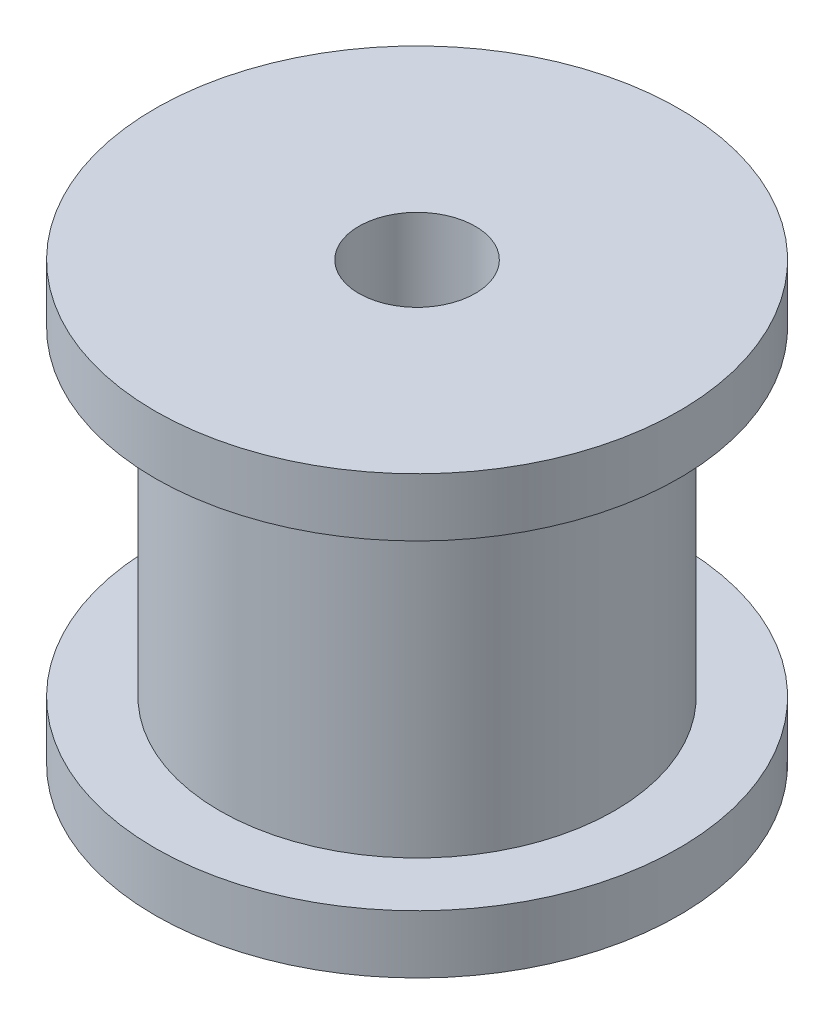
ISO-10303-21;
HEADER;
FILE_DESCRIPTION(('STEP AP214'),'2;1');
FILE_NAME('part.step','',(''),(''),'','','');
FILE_SCHEMA(('AUTOMOTIVE_DESIGN { 1 0 10303 214 1 1 1 1 }'));
ENDSEC;
DATA;
#1=APPLICATION_CONTEXT('core data for automotive mechanical design processes');
#2=APPLICATION_PROTOCOL_DEFINITION('international standard','automotive_design',2000,#1);
#3=PRODUCT_CONTEXT('',#1,'mechanical');
#4=PRODUCT('Part','Part','',(#3));
#5=PRODUCT_RELATED_PRODUCT_CATEGORY('part','',(#4));
#6=PRODUCT_DEFINITION_FORMATION('','',#4);
#7=PRODUCT_DEFINITION_CONTEXT('part definition',#1,'design');
#8=PRODUCT_DEFINITION('design','',#6,#7);
#9=PRODUCT_DEFINITION_SHAPE('','',#8);
#10=(LENGTH_UNIT() NAMED_UNIT(*) SI_UNIT(.MILLI.,.METRE.));
#11=(NAMED_UNIT(*) PLANE_ANGLE_UNIT() SI_UNIT($,.RADIAN.));
#12=(NAMED_UNIT(*) SI_UNIT($,.STERADIAN.) SOLID_ANGLE_UNIT());
#13=UNCERTAINTY_MEASURE_WITH_UNIT(LENGTH_MEASURE(1.E-05),#10,'distance_accuracy_value','');
#14=(GEOMETRIC_REPRESENTATION_CONTEXT(3) GLOBAL_UNCERTAINTY_ASSIGNED_CONTEXT((#13)) GLOBAL_UNIT_ASSIGNED_CONTEXT((#10,
#11,#12)) REPRESENTATION_CONTEXT('',''));
#15=CARTESIAN_POINT('',(0.,0.,0.));
#16=DIRECTION('',(0.,0.,1.));
#17=DIRECTION('',(1.,0.,0.));
#18=AXIS2_PLACEMENT_3D('',#15,#16,#17);
#19=CARTESIAN_POINT('',(0.,2.,0.));
#20=DIRECTION('',(0.,-1.,0.));
#21=DIRECTION('',(0.,0.,-1.));
#22=AXIS2_PLACEMENT_3D('',#19,#20,#21);
#23=CYLINDRICAL_SURFACE('',#22,9.);
#24=CARTESIAN_POINT('',(0.,2.,0.));
#25=DIRECTION('',(0.,1.,0.));
#26=DIRECTION('',(0.,0.,1.));
#27=AXIS2_PLACEMENT_3D('',#24,#25,#26);
#28=CIRCLE('',#27,9.);
#29=CARTESIAN_POINT('',(0.,2.,9.));
#30=VERTEX_POINT('',#29);
#31=EDGE_CURVE('E49',#30,#30,#28,.T.);
#32=ORIENTED_EDGE('',*,*,#31,.F.);
#33=EDGE_LOOP('',(#32));
#34=FACE_BOUND('',#33,.T.);
#35=CARTESIAN_POINT('',(0.,0.,0.));
#36=DIRECTION('',(0.,1.,0.));
#37=DIRECTION('',(0.,0.,1.));
#38=AXIS2_PLACEMENT_3D('',#35,#36,#37);
#39=CIRCLE('',#38,9.);
#40=CARTESIAN_POINT('',(0.,0.,9.));
#41=VERTEX_POINT('',#40);
#42=EDGE_CURVE('E44',#41,#41,#39,.T.);
#43=ORIENTED_EDGE('',*,*,#42,.T.);
#44=EDGE_LOOP('',(#43));
#45=FACE_BOUND('',#44,.T.);
#46=ADVANCED_FACE('F41',(#34,#45),#23,.T.);
#47=CARTESIAN_POINT('',(0.,2.,0.));
#48=DIRECTION('',(0.,1.,0.));
#49=DIRECTION('',(0.,0.,1.));
#50=AXIS2_PLACEMENT_3D('',#47,#48,#49);
#51=PLANE('',#50);
#52=CARTESIAN_POINT('',(0.,2.,0.));
#53=DIRECTION('',(0.,1.,0.));
#54=DIRECTION('',(0.,0.,1.));
#55=AXIS2_PLACEMENT_3D('',#52,#53,#54);
#56=CIRCLE('',#55,6.78);
#57=CARTESIAN_POINT('',(0.,2.,6.78));
#58=VERTEX_POINT('',#57);
#59=EDGE_CURVE('E10',#58,#58,#56,.T.);
#60=ORIENTED_EDGE('',*,*,#59,.F.);
#61=EDGE_LOOP('',(#60));
#62=FACE_BOUND('',#61,.T.);
#63=ORIENTED_EDGE('',*,*,#31,.T.);
#64=EDGE_LOOP('',(#63));
#65=FACE_BOUND('',#64,.T.);
#66=ADVANCED_FACE('F102',(#62,#65),#51,.T.);
#67=CARTESIAN_POINT('',(0.,0.,0.));
#68=DIRECTION('',(0.,1.,0.));
#69=DIRECTION('',(0.,0.,1.));
#70=AXIS2_PLACEMENT_3D('',#67,#68,#69);
#71=PLANE('',#70);
#72=CARTESIAN_POINT('',(0.,0.,0.));
#73=DIRECTION('',(0.,1.,0.));
#74=DIRECTION('',(0.,0.,1.));
#75=AXIS2_PLACEMENT_3D('',#72,#73,#74);
#76=CIRCLE('',#75,2.);
#77=CARTESIAN_POINT('',(0.,0.,2.));
#78=VERTEX_POINT('',#77);
#79=EDGE_CURVE('E65',#78,#78,#76,.T.);
#80=ORIENTED_EDGE('',*,*,#79,.T.);
#81=EDGE_LOOP('',(#80));
#82=FACE_BOUND('',#81,.T.);
#83=ORIENTED_EDGE('',*,*,#42,.F.);
#84=EDGE_LOOP('',(#83));
#85=FACE_BOUND('',#84,.T.);
#86=ADVANCED_FACE('F107',(#82,#85),#71,.F.);
#87=CARTESIAN_POINT('',(0.,13.,0.));
#88=DIRECTION('',(0.,-1.,0.));
#89=DIRECTION('',(0.,0.,-1.));
#90=AXIS2_PLACEMENT_3D('',#87,#88,#89);
#91=CYLINDRICAL_SURFACE('',#90,6.78);
#92=CARTESIAN_POINT('',(0.,13.,0.));
#93=DIRECTION('',(0.,1.,0.));
#94=DIRECTION('',(0.,0.,1.));
#95=AXIS2_PLACEMENT_3D('',#92,#93,#94);
#96=CIRCLE('',#95,6.78);
#97=CARTESIAN_POINT('',(0.,13.,6.78));
#98=VERTEX_POINT('',#97);
#99=EDGE_CURVE('E56',#98,#98,#96,.T.);
#100=ORIENTED_EDGE('',*,*,#99,.F.);
#101=EDGE_LOOP('',(#100));
#102=FACE_BOUND('',#101,.T.);
#103=ORIENTED_EDGE('',*,*,#59,.T.);
#104=EDGE_LOOP('',(#103));
#105=FACE_BOUND('',#104,.T.);
#106=ADVANCED_FACE('F90',(#102,#105),#91,.T.);
#107=CARTESIAN_POINT('',(0.,15.,0.));
#108=DIRECTION('',(0.,-1.,0.));
#109=DIRECTION('',(0.,0.,-1.));
#110=AXIS2_PLACEMENT_3D('',#107,#108,#109);
#111=CYLINDRICAL_SURFACE('',#110,9.);
#112=CARTESIAN_POINT('',(0.,15.,0.));
#113=DIRECTION('',(0.,1.,0.));
#114=DIRECTION('',(0.,0.,1.));
#115=AXIS2_PLACEMENT_3D('',#112,#113,#114);
#116=CIRCLE('',#115,9.);
#117=CARTESIAN_POINT('',(0.,15.,9.));
#118=VERTEX_POINT('',#117);
#119=EDGE_CURVE('E60',#118,#118,#116,.T.);
#120=ORIENTED_EDGE('',*,*,#119,.F.);
#121=EDGE_LOOP('',(#120));
#122=FACE_BOUND('',#121,.T.);
#123=CARTESIAN_POINT('',(0.,13.,0.));
#124=DIRECTION('',(0.,1.,0.));
#125=DIRECTION('',(0.,0.,1.));
#126=AXIS2_PLACEMENT_3D('',#123,#124,#125);
#127=CIRCLE('',#126,9.);
#128=CARTESIAN_POINT('',(0.,13.,9.));
#129=VERTEX_POINT('',#128);
#130=EDGE_CURVE('E61',#129,#129,#127,.T.);
#131=ORIENTED_EDGE('',*,*,#130,.T.);
#132=EDGE_LOOP('',(#131));
#133=FACE_BOUND('',#132,.T.);
#134=ADVANCED_FACE('F84',(#122,#133),#111,.T.);
#135=CARTESIAN_POINT('',(0.,15.,0.));
#136=DIRECTION('',(0.,1.,0.));
#137=DIRECTION('',(0.,0.,1.));
#138=AXIS2_PLACEMENT_3D('',#135,#136,#137);
#139=PLANE('',#138);
#140=CARTESIAN_POINT('',(0.,15.,0.));
#141=DIRECTION('',(0.,1.,0.));
#142=DIRECTION('',(0.,0.,1.));
#143=AXIS2_PLACEMENT_3D('',#140,#141,#142);
#144=CIRCLE('',#143,2.);
#145=CARTESIAN_POINT('',(0.,15.,2.));
#146=VERTEX_POINT('',#145);
#147=EDGE_CURVE('E72',#146,#146,#144,.T.);
#148=ORIENTED_EDGE('',*,*,#147,.F.);
#149=EDGE_LOOP('',(#148));
#150=FACE_BOUND('',#149,.T.);
#151=ORIENTED_EDGE('',*,*,#119,.T.);
#152=EDGE_LOOP('',(#151));
#153=FACE_BOUND('',#152,.T.);
#154=ADVANCED_FACE('F80',(#150,#153),#139,.T.);
#155=CARTESIAN_POINT('',(0.,13.,0.));
#156=DIRECTION('',(0.,1.,0.));
#157=DIRECTION('',(0.,0.,1.));
#158=AXIS2_PLACEMENT_3D('',#155,#156,#157);
#159=PLANE('',#158);
#160=ORIENTED_EDGE('',*,*,#99,.T.);
#161=EDGE_LOOP('',(#160));
#162=FACE_BOUND('',#161,.T.);
#163=ORIENTED_EDGE('',*,*,#130,.F.);
#164=EDGE_LOOP('',(#163));
#165=FACE_BOUND('',#164,.T.);
#166=ADVANCED_FACE('F83',(#162,#165),#159,.F.);
#167=CARTESIAN_POINT('',(0.,-11.,0.));
#168=DIRECTION('',(0.,1.,0.));
#169=DIRECTION('',(0.,0.,1.));
#170=AXIS2_PLACEMENT_3D('',#167,#168,#169);
#171=CYLINDRICAL_SURFACE('',#170,2.);
#172=CARTESIAN_POINT('',(0.,15.,2.));
#173=CARTESIAN_POINT('',(0.,14.84375,2.));
#174=CARTESIAN_POINT('',(0.,14.6875,2.));
#175=CARTESIAN_POINT('',(0.,14.375,2.));
#176=CARTESIAN_POINT('',(0.,14.21875,2.));
#177=CARTESIAN_POINT('',(0.,13.90625,2.));
#178=CARTESIAN_POINT('',(0.,13.75,2.));
#179=CARTESIAN_POINT('',(0.,13.4375,2.));
#180=CARTESIAN_POINT('',(0.,13.28125,2.));
#181=CARTESIAN_POINT('',(0.,12.96875,2.));
#182=CARTESIAN_POINT('',(0.,12.8125,2.));
#183=CARTESIAN_POINT('',(0.,12.5,2.));
#184=CARTESIAN_POINT('',(0.,12.34375,2.));
#185=CARTESIAN_POINT('',(0.,12.03125,2.));
#186=CARTESIAN_POINT('',(0.,11.875,2.));
#187=CARTESIAN_POINT('',(0.,11.5625,2.));
#188=CARTESIAN_POINT('',(0.,11.40625,2.));
#189=CARTESIAN_POINT('',(0.,11.09375,2.));
#190=CARTESIAN_POINT('',(0.,10.9375,2.));
#191=CARTESIAN_POINT('',(0.,10.625,2.));
#192=CARTESIAN_POINT('',(0.,10.46875,2.));
#193=CARTESIAN_POINT('',(0.,10.15625,2.));
#194=CARTESIAN_POINT('',(0.,10.,2.));
#195=CARTESIAN_POINT('',(0.,9.6875,2.));
#196=CARTESIAN_POINT('',(0.,9.53125,2.));
#197=CARTESIAN_POINT('',(0.,9.21875,2.));
#198=CARTESIAN_POINT('',(0.,9.0625,2.));
#199=CARTESIAN_POINT('',(0.,8.75,2.));
#200=CARTESIAN_POINT('',(0.,8.59375,2.));
#201=CARTESIAN_POINT('',(0.,8.28125,2.));
#202=CARTESIAN_POINT('',(0.,8.125,2.));
#203=CARTESIAN_POINT('',(0.,7.8125,2.));
#204=CARTESIAN_POINT('',(0.,7.65625,2.));
#205=CARTESIAN_POINT('',(0.,7.34375,2.));
#206=CARTESIAN_POINT('',(0.,7.1875,2.));
#207=CARTESIAN_POINT('',(0.,6.875,2.));
#208=CARTESIAN_POINT('',(0.,6.71875,2.));
#209=CARTESIAN_POINT('',(0.,6.40625,2.));
#210=CARTESIAN_POINT('',(0.,6.25,2.));
#211=CARTESIAN_POINT('',(0.,5.9375,2.));
#212=CARTESIAN_POINT('',(0.,5.78125,2.));
#213=CARTESIAN_POINT('',(0.,5.46875,2.));
#214=CARTESIAN_POINT('',(0.,5.3125,2.));
#215=CARTESIAN_POINT('',(0.,5.,2.));
#216=CARTESIAN_POINT('',(0.,4.84375,2.));
#217=CARTESIAN_POINT('',(0.,4.53125,2.));
#218=CARTESIAN_POINT('',(0.,4.375,2.));
#219=CARTESIAN_POINT('',(0.,4.0625,2.));
#220=CARTESIAN_POINT('',(0.,3.90625,2.));
#221=CARTESIAN_POINT('',(0.,3.59375,2.));
#222=CARTESIAN_POINT('',(0.,3.4375,2.));
#223=CARTESIAN_POINT('',(0.,3.125,2.));
#224=CARTESIAN_POINT('',(0.,2.96875,2.));
#225=CARTESIAN_POINT('',(0.,2.65625,2.));
#226=CARTESIAN_POINT('',(0.,2.5,2.));
#227=CARTESIAN_POINT('',(0.,2.1875,2.));
#228=CARTESIAN_POINT('',(0.,2.03125,2.));
#229=CARTESIAN_POINT('',(0.,1.71875,2.));
#230=CARTESIAN_POINT('',(0.,1.5625,2.));
#231=CARTESIAN_POINT('',(0.,1.25,2.));
#232=CARTESIAN_POINT('',(0.,1.09375,2.));
#233=CARTESIAN_POINT('',(0.,0.781249999999999,2.));
#234=CARTESIAN_POINT('',(0.,0.624999999999999,2.));
#235=CARTESIAN_POINT('',(0.,0.312499999999999,2.));
#236=CARTESIAN_POINT('',(0.,0.156249999999998,2.));
#237=CARTESIAN_POINT('',(0.,0.,2.));
#238=B_SPLINE_CURVE_WITH_KNOTS('',3,(#172,#173,#174,#175,#176,#177,#178,#179,#180,#181,#182,
#183,#184,#185,#186,#187,#188,#189,#190,#191,#192,#193,#194,#195,#196,#197,#198,#199,#200,#201,
#202,#203,#204,#205,#206,#207,#208,#209,#210,#211,#212,#213,#214,#215,#216,#217,#218,#219,#220,
#221,#222,#223,#224,#225,#226,#227,#228,#229,#230,#231,#232,#233,#234,#235,#236,#237),
.UNSPECIFIED.,.F.,.F.,(4,2,2,2,2,2,2,2,2,2,2,2,2,2,2,2,2,2,2,2,2,2,2,2,2,2,2,2,2,2,2,2,4),(0.,
0.46875,0.937500000000001,1.40625,1.875,2.34375,2.8125,3.28125,3.75,4.21875,4.6875,5.15625,
5.625,6.09375,6.5625,7.03125,7.5,7.96875,8.4375,8.90625,9.375,9.84375,10.3125,10.78125,11.25,
11.71875,12.1875,12.65625,13.125,13.59375,14.0625,14.53125,15.),.UNSPECIFIED.);
#239=EDGE_CURVE('BSEAM77',#146,#78,#238,.T.);
#240=ORIENTED_EDGE('',*,*,#147,.T.);
#241=ORIENTED_EDGE('',*,*,#79,.F.);
#242=ORIENTED_EDGE('',*,*,#239,.T.);
#243=ORIENTED_EDGE('',*,*,#239,.F.);
#244=EDGE_LOOP('',(#240,#242,#241,#243));
#245=FACE_BOUND('',#244,.T.);
#246=ADVANCED_FACE('F77',(#245),#171,.F.);
#247=CLOSED_SHELL('',(#46,#66,#86,#106,#134,#154,#166,#246));
#248=MANIFOLD_SOLID_BREP('B2',#247);
#249=ADVANCED_BREP_SHAPE_REPRESENTATION('',(#18,#248),#14);
#250=SHAPE_DEFINITION_REPRESENTATION(#9,#249);
ENDSEC;
END-ISO-10303-21;
